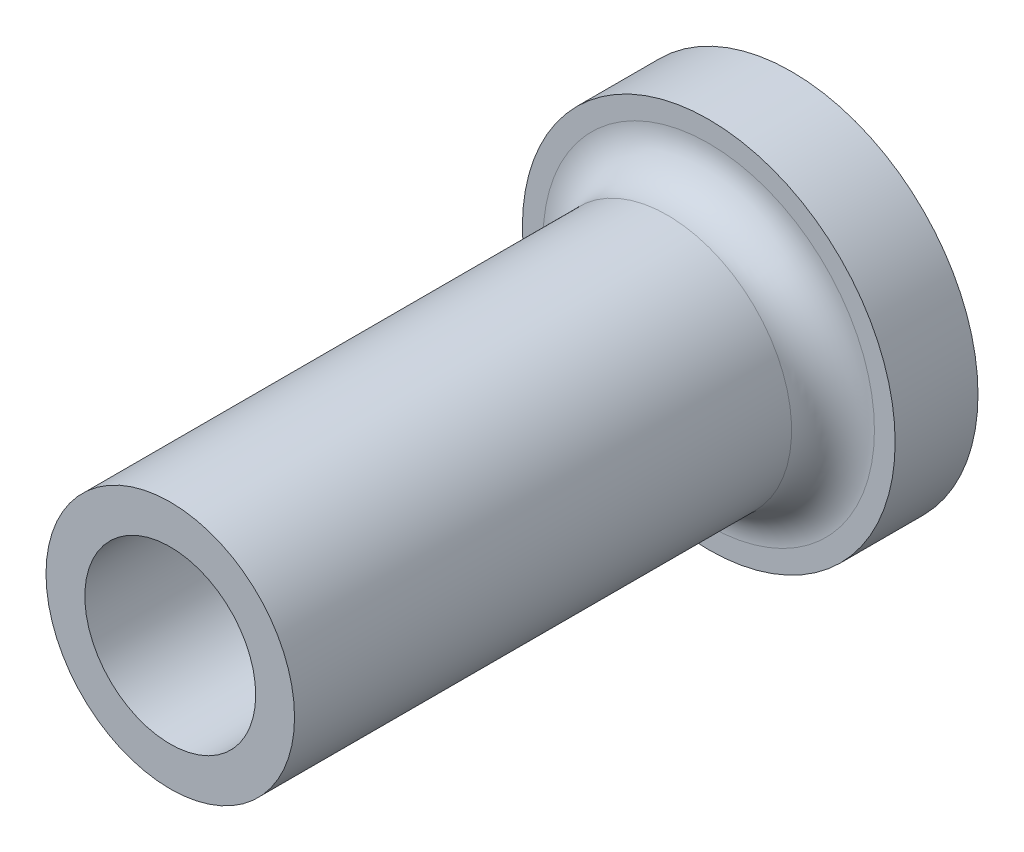
ISO-10303-21;
HEADER;
FILE_DESCRIPTION(('STEP AP214'),'2;1');
FILE_NAME('part.step','',(''),(''),'','','');
FILE_SCHEMA(('AUTOMOTIVE_DESIGN { 1 0 10303 214 1 1 1 1 }'));
ENDSEC;
DATA;
#1=APPLICATION_CONTEXT('core data for automotive mechanical design processes');
#2=APPLICATION_PROTOCOL_DEFINITION('international standard','automotive_design',2000,#1);
#3=PRODUCT_CONTEXT('',#1,'mechanical');
#4=PRODUCT('Part','Part','',(#3));
#5=PRODUCT_RELATED_PRODUCT_CATEGORY('part','',(#4));
#6=PRODUCT_DEFINITION_FORMATION('','',#4);
#7=PRODUCT_DEFINITION_CONTEXT('part definition',#1,'design');
#8=PRODUCT_DEFINITION('design','',#6,#7);
#9=PRODUCT_DEFINITION_SHAPE('','',#8);
#10=(LENGTH_UNIT() NAMED_UNIT(*) SI_UNIT(.MILLI.,.METRE.));
#11=(NAMED_UNIT(*) PLANE_ANGLE_UNIT() SI_UNIT($,.RADIAN.));
#12=(NAMED_UNIT(*) SI_UNIT($,.STERADIAN.) SOLID_ANGLE_UNIT());
#13=UNCERTAINTY_MEASURE_WITH_UNIT(LENGTH_MEASURE(1.E-05),#10,'distance_accuracy_value','');
#14=(GEOMETRIC_REPRESENTATION_CONTEXT(3) GLOBAL_UNCERTAINTY_ASSIGNED_CONTEXT((#13)) GLOBAL_UNIT_ASSIGNED_CONTEXT((#10,
#11,#12)) REPRESENTATION_CONTEXT('',''));
#15=CARTESIAN_POINT('',(0.,0.,0.));
#16=DIRECTION('',(0.,0.,1.));
#17=DIRECTION('',(1.,0.,0.));
#18=AXIS2_PLACEMENT_3D('',#15,#16,#17);
#19=CARTESIAN_POINT('',(0.,0.,30.));
#20=DIRECTION('',(0.,0.,-1.));
#21=DIRECTION('',(-1.,0.,0.));
#22=AXIS2_PLACEMENT_3D('',#19,#20,#21);
#23=CYLINDRICAL_SURFACE('',#22,6.);
#24=CARTESIAN_POINT('',(0.,0.,6.));
#25=DIRECTION('',(0.,0.,-1.));
#26=DIRECTION('',(-1.,0.,0.));
#27=AXIS2_PLACEMENT_3D('',#24,#25,#26);
#28=CIRCLE('',#27,6.);
#29=CARTESIAN_POINT('',(-6.,0.,6.));
#30=VERTEX_POINT('',#29);
#31=EDGE_CURVE('E10',#30,#30,#28,.F.);
#32=ORIENTED_EDGE('',*,*,#31,.T.);
#33=EDGE_LOOP('',(#32));
#34=FACE_BOUND('',#33,.T.);
#35=CARTESIAN_POINT('',(0.,0.,30.));
#36=DIRECTION('',(0.,0.,1.));
#37=DIRECTION('',(1.,0.,0.));
#38=AXIS2_PLACEMENT_3D('',#35,#36,#37);
#39=CIRCLE('',#38,6.);
#40=CARTESIAN_POINT('',(6.,0.,30.));
#41=VERTEX_POINT('',#40);
#42=EDGE_CURVE('E50',#41,#41,#39,.T.);
#43=ORIENTED_EDGE('',*,*,#42,.F.);
#44=EDGE_LOOP('',(#43));
#45=FACE_BOUND('',#44,.T.);
#46=ADVANCED_FACE('F37',(#34,#45),#23,.T.);
#47=CARTESIAN_POINT('',(0.,0.,30.));
#48=DIRECTION('',(0.,0.,1.));
#49=DIRECTION('',(1.,0.,0.));
#50=AXIS2_PLACEMENT_3D('',#47,#48,#49);
#51=PLANE('',#50);
#52=ORIENTED_EDGE('',*,*,#42,.T.);
#53=EDGE_LOOP('',(#52));
#54=FACE_BOUND('',#53,.T.);
#55=CARTESIAN_POINT('',(0.,0.,30.));
#56=DIRECTION('',(0.,0.,1.));
#57=DIRECTION('',(1.,0.,0.));
#58=AXIS2_PLACEMENT_3D('',#55,#56,#57);
#59=CIRCLE('',#58,4.125);
#60=CARTESIAN_POINT('',(4.125,0.,30.));
#61=VERTEX_POINT('',#60);
#62=EDGE_CURVE('E55',#61,#61,#59,.T.);
#63=ORIENTED_EDGE('',*,*,#62,.F.);
#64=EDGE_LOOP('',(#63));
#65=FACE_BOUND('',#64,.T.);
#66=ADVANCED_FACE('F90',(#54,#65),#51,.T.);
#67=CARTESIAN_POINT('',(0.,0.,0.));
#68=DIRECTION('',(0.,0.,1.));
#69=DIRECTION('',(1.,0.,0.));
#70=AXIS2_PLACEMENT_3D('',#67,#68,#69);
#71=PLANE('',#70);
#72=CARTESIAN_POINT('',(0.,0.,0.));
#73=DIRECTION('',(0.,0.,1.));
#74=DIRECTION('',(1.,0.,0.));
#75=AXIS2_PLACEMENT_3D('',#72,#73,#74);
#76=CIRCLE('',#75,4.125);
#77=CARTESIAN_POINT('',(4.125,0.,0.));
#78=VERTEX_POINT('',#77);
#79=EDGE_CURVE('E58',#78,#78,#76,.T.);
#80=ORIENTED_EDGE('',*,*,#79,.T.);
#81=EDGE_LOOP('',(#80));
#82=FACE_BOUND('',#81,.T.);
#83=CARTESIAN_POINT('',(0.,0.,0.));
#84=DIRECTION('',(0.,0.,-1.));
#85=DIRECTION('',(-1.,0.,0.));
#86=AXIS2_PLACEMENT_3D('',#83,#84,#85);
#87=CIRCLE('',#86,9.);
#88=CARTESIAN_POINT('',(-9.,0.,0.));
#89=VERTEX_POINT('',#88);
#90=EDGE_CURVE('E66',#89,#89,#87,.T.);
#91=ORIENTED_EDGE('',*,*,#90,.T.);
#92=EDGE_LOOP('',(#91));
#93=FACE_BOUND('',#92,.T.);
#94=ADVANCED_FACE('F86',(#82,#93),#71,.F.);
#95=CARTESIAN_POINT('',(0.,0.,30.));
#96=DIRECTION('',(0.,0.,-1.));
#97=DIRECTION('',(-1.,0.,0.));
#98=AXIS2_PLACEMENT_3D('',#95,#96,#97);
#99=CYLINDRICAL_SURFACE('',#98,4.125);
#100=ORIENTED_EDGE('',*,*,#79,.F.);
#101=EDGE_LOOP('',(#100));
#102=FACE_BOUND('',#101,.T.);
#103=ORIENTED_EDGE('',*,*,#62,.T.);
#104=EDGE_LOOP('',(#103));
#105=FACE_BOUND('',#104,.T.);
#106=ADVANCED_FACE('F79',(#102,#105),#99,.F.);
#107=CARTESIAN_POINT('',(0.,0.,4.));
#108=DIRECTION('',(0.,0.,-1.));
#109=DIRECTION('',(-1.,0.,0.));
#110=AXIS2_PLACEMENT_3D('',#107,#108,#109);
#111=PLANE('',#110);
#112=CARTESIAN_POINT('',(0.,0.,4.));
#113=DIRECTION('',(0.,0.,-1.));
#114=DIRECTION('',(-1.,0.,0.));
#115=AXIS2_PLACEMENT_3D('',#112,#113,#114);
#116=CIRCLE('',#115,8.);
#117=CARTESIAN_POINT('',(-8.,0.,4.));
#118=VERTEX_POINT('',#117);
#119=EDGE_CURVE('E45',#118,#118,#116,.T.);
#120=ORIENTED_EDGE('',*,*,#119,.T.);
#121=EDGE_LOOP('',(#120));
#122=FACE_BOUND('',#121,.T.);
#123=CARTESIAN_POINT('',(0.,0.,4.));
#124=DIRECTION('',(0.,0.,-1.));
#125=DIRECTION('',(-1.,0.,0.));
#126=AXIS2_PLACEMENT_3D('',#123,#124,#125);
#127=CIRCLE('',#126,9.);
#128=CARTESIAN_POINT('',(-9.,0.,4.));
#129=VERTEX_POINT('',#128);
#130=EDGE_CURVE('E62',#129,#129,#127,.T.);
#131=ORIENTED_EDGE('',*,*,#130,.F.);
#132=EDGE_LOOP('',(#131));
#133=FACE_BOUND('',#132,.T.);
#134=ADVANCED_FACE('F77',(#122,#133),#111,.F.);
#135=CARTESIAN_POINT('',(0.,0.,4.));
#136=DIRECTION('',(0.,0.,-1.));
#137=DIRECTION('',(-1.,0.,0.));
#138=AXIS2_PLACEMENT_3D('',#135,#136,#137);
#139=CYLINDRICAL_SURFACE('',#138,9.);
#140=ORIENTED_EDGE('',*,*,#130,.T.);
#141=EDGE_LOOP('',(#140));
#142=FACE_BOUND('',#141,.T.);
#143=ORIENTED_EDGE('',*,*,#90,.F.);
#144=EDGE_LOOP('',(#143));
#145=FACE_BOUND('',#144,.T.);
#146=ADVANCED_FACE('F74',(#142,#145),#139,.T.);
#147=CARTESIAN_POINT('',(0.,0.,6.));
#148=DIRECTION('',(0.,0.,-1.));
#149=DIRECTION('',(-1.,0.,0.));
#150=AXIS2_PLACEMENT_3D('',#147,#148,#149);
#151=TOROIDAL_SURFACE('',#150,8.,2.);
#152=ORIENTED_EDGE('',*,*,#31,.F.);
#153=EDGE_LOOP('',(#152));
#154=FACE_BOUND('',#153,.T.);
#155=ORIENTED_EDGE('',*,*,#119,.F.);
#156=EDGE_LOOP('',(#155));
#157=FACE_BOUND('',#156,.T.);
#158=ADVANCED_FACE('F39',(#154,#157),#151,.F.);
#159=CLOSED_SHELL('',(#46,#66,#94,#106,#134,#146,#158));
#160=MANIFOLD_SOLID_BREP('B2',#159);
#161=ADVANCED_BREP_SHAPE_REPRESENTATION('',(#18,#160),#14);
#162=SHAPE_DEFINITION_REPRESENTATION(#9,#161);
ENDSEC;
END-ISO-10303-21;
